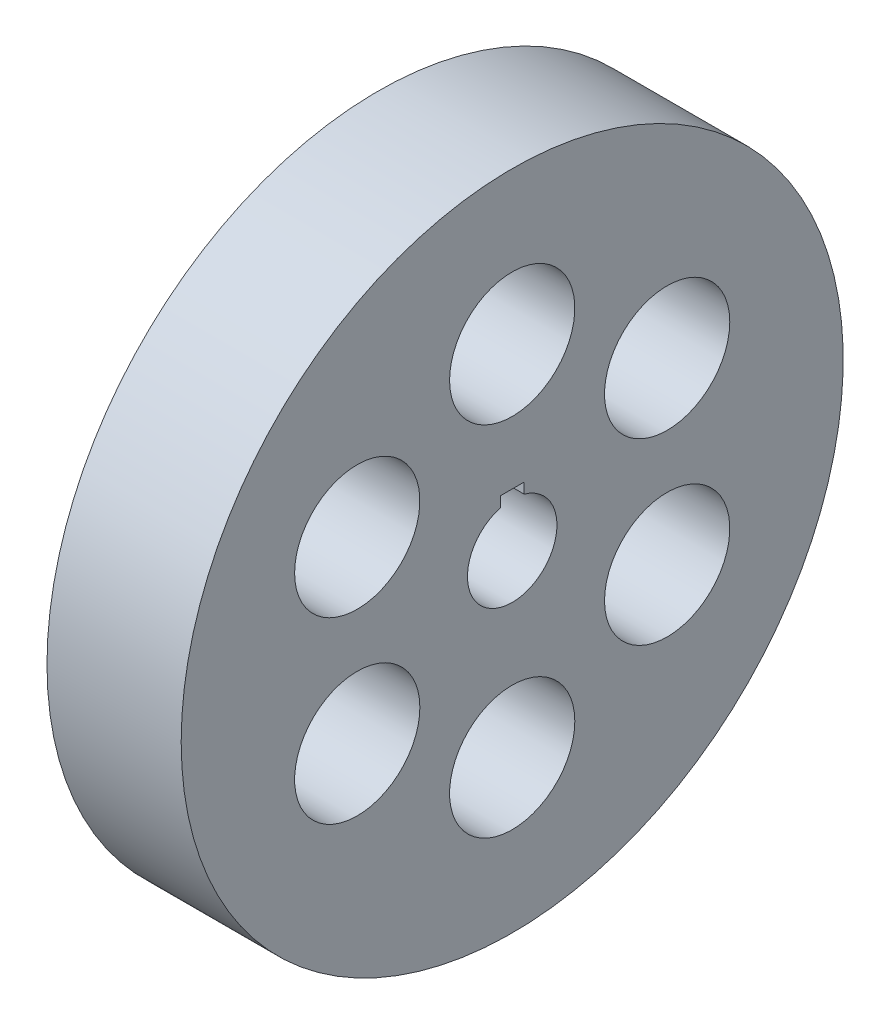
ISO-10303-21;
HEADER;
FILE_DESCRIPTION(('STEP AP214'),'2;1');
FILE_NAME('part.step','',(''),(''),'','','');
FILE_SCHEMA(('AUTOMOTIVE_DESIGN { 1 0 10303 214 1 1 1 1 }'));
ENDSEC;
DATA;
#1=APPLICATION_CONTEXT('core data for automotive mechanical design processes');
#2=APPLICATION_PROTOCOL_DEFINITION('international standard','automotive_design',2000,#1);
#3=PRODUCT_CONTEXT('',#1,'mechanical');
#4=PRODUCT('Part','Part','',(#3));
#5=PRODUCT_RELATED_PRODUCT_CATEGORY('part','',(#4));
#6=PRODUCT_DEFINITION_FORMATION('','',#4);
#7=PRODUCT_DEFINITION_CONTEXT('part definition',#1,'design');
#8=PRODUCT_DEFINITION('design','',#6,#7);
#9=PRODUCT_DEFINITION_SHAPE('','',#8);
#10=(LENGTH_UNIT() NAMED_UNIT(*) SI_UNIT(.MILLI.,.METRE.));
#11=(NAMED_UNIT(*) PLANE_ANGLE_UNIT() SI_UNIT($,.RADIAN.));
#12=(NAMED_UNIT(*) SI_UNIT($,.STERADIAN.) SOLID_ANGLE_UNIT());
#13=UNCERTAINTY_MEASURE_WITH_UNIT(LENGTH_MEASURE(1.E-05),#10,'distance_accuracy_value','');
#14=(GEOMETRIC_REPRESENTATION_CONTEXT(3) GLOBAL_UNCERTAINTY_ASSIGNED_CONTEXT((#13)) GLOBAL_UNIT_ASSIGNED_CONTEXT((#10,
#11,#12)) REPRESENTATION_CONTEXT('',''));
#15=CARTESIAN_POINT('',(0.,0.,0.));
#16=DIRECTION('',(0.,0.,1.));
#17=DIRECTION('',(1.,0.,0.));
#18=AXIS2_PLACEMENT_3D('',#15,#16,#17);
#19=CARTESIAN_POINT('',(70.,0.,-111.));
#20=DIRECTION('',(-1.,0.,0.));
#21=DIRECTION('',(0.,0.,1.));
#22=AXIS2_PLACEMENT_3D('',#19,#20,#21);
#23=PLANE('',#22);
#24=DIRECTION('',(0.,1.,0.));
#25=VECTOR('',#24,1.);
#26=CARTESIAN_POINT('',(70.,11.5,4.));
#27=LINE('',#26,#25);
#28=CARTESIAN_POINT('',(70.,14.456832294801,4.));
#29=VERTEX_POINT('',#28);
#30=CARTESIAN_POINT('',(70.,17.956832294801,4.));
#31=VERTEX_POINT('',#30);
#32=EDGE_CURVE('E97',#29,#31,#27,.T.);
#33=ORIENTED_EDGE('',*,*,#32,.T.);
#34=DIRECTION('',(0.,0.,-1.));
#35=VECTOR('',#34,1.);
#36=CARTESIAN_POINT('',(70.,17.956832294801,-4.));
#37=LINE('',#36,#35);
#38=CARTESIAN_POINT('',(70.,17.956832294801,-4.));
#39=VERTEX_POINT('',#38);
#40=EDGE_CURVE('E102',#31,#39,#37,.T.);
#41=ORIENTED_EDGE('',*,*,#40,.T.);
#42=DIRECTION('',(0.,-1.,0.));
#43=VECTOR('',#42,1.);
#44=CARTESIAN_POINT('',(70.,11.5,-4.));
#45=LINE('',#44,#43);
#46=CARTESIAN_POINT('',(70.,14.456832294801,-4.));
#47=VERTEX_POINT('',#46);
#48=EDGE_CURVE('E61',#39,#47,#45,.T.);
#49=ORIENTED_EDGE('',*,*,#48,.T.);
#50=CARTESIAN_POINT('',(70.,0.,0.));
#51=DIRECTION('',(-1.,0.,0.));
#52=DIRECTION('',(0.,0.,1.));
#53=AXIS2_PLACEMENT_3D('',#50,#51,#52);
#54=CIRCLE('',#53,15.);
#55=EDGE_CURVE('E106',#47,#29,#54,.T.);
#56=ORIENTED_EDGE('',*,*,#55,.T.);
#57=EDGE_LOOP('',(#33,#41,#49,#56));
#58=FACE_BOUND('',#57,.T.);
#59=CARTESIAN_POINT('',(70.,30.0000000000001,51.9615242270663));
#60=DIRECTION('',(-1.,0.,0.));
#61=DIRECTION('',(0.,0.,1.));
#62=AXIS2_PLACEMENT_3D('',#59,#60,#61);
#63=CIRCLE('',#62,21.);
#64=CARTESIAN_POINT('',(70.,30.0000000000001,72.9615242270663));
#65=VERTEX_POINT('',#64);
#66=EDGE_CURVE('E116',#65,#65,#63,.T.);
#67=ORIENTED_EDGE('',*,*,#66,.T.);
#68=EDGE_LOOP('',(#67));
#69=FACE_BOUND('',#68,.T.);
#70=CARTESIAN_POINT('',(70.,30.0000000000001,-51.9615242270663));
#71=DIRECTION('',(-1.,0.,0.));
#72=DIRECTION('',(0.,0.,-1.));
#73=AXIS2_PLACEMENT_3D('',#70,#71,#72);
#74=CIRCLE('',#73,21.);
#75=CARTESIAN_POINT('',(70.,30.0000000000001,-72.9615242270663));
#76=VERTEX_POINT('',#75);
#77=EDGE_CURVE('E123',#76,#76,#74,.T.);
#78=ORIENTED_EDGE('',*,*,#77,.T.);
#79=EDGE_LOOP('',(#78));
#80=FACE_BOUND('',#79,.T.);
#81=CARTESIAN_POINT('',(70.,-30.0000000000001,51.9615242270663));
#82=DIRECTION('',(-1.,0.,0.));
#83=DIRECTION('',(0.,0.,-1.));
#84=AXIS2_PLACEMENT_3D('',#81,#82,#83);
#85=CIRCLE('',#84,21.);
#86=CARTESIAN_POINT('',(70.,-30.0000000000001,30.9615242270663));
#87=VERTEX_POINT('',#86);
#88=EDGE_CURVE('E129',#87,#87,#85,.T.);
#89=ORIENTED_EDGE('',*,*,#88,.T.);
#90=EDGE_LOOP('',(#89));
#91=FACE_BOUND('',#90,.T.);
#92=CARTESIAN_POINT('',(70.,-60.,0.));
#93=DIRECTION('',(-1.,0.,0.));
#94=DIRECTION('',(0.,0.,-1.));
#95=AXIS2_PLACEMENT_3D('',#92,#93,#94);
#96=CIRCLE('',#95,21.);
#97=CARTESIAN_POINT('',(70.,-60.,-21.));
#98=VERTEX_POINT('',#97);
#99=EDGE_CURVE('E135',#98,#98,#96,.T.);
#100=ORIENTED_EDGE('',*,*,#99,.T.);
#101=EDGE_LOOP('',(#100));
#102=FACE_BOUND('',#101,.T.);
#103=CARTESIAN_POINT('',(70.,-30.0000000000001,-51.9615242270663));
#104=DIRECTION('',(-1.,0.,0.));
#105=DIRECTION('',(0.,0.,1.));
#106=AXIS2_PLACEMENT_3D('',#103,#104,#105);
#107=CIRCLE('',#106,21.);
#108=CARTESIAN_POINT('',(70.,-30.0000000000001,-30.9615242270663));
#109=VERTEX_POINT('',#108);
#110=EDGE_CURVE('E110',#109,#109,#107,.T.);
#111=ORIENTED_EDGE('',*,*,#110,.T.);
#112=EDGE_LOOP('',(#111));
#113=FACE_BOUND('',#112,.T.);
#114=CARTESIAN_POINT('',(70.,60.,0.));
#115=DIRECTION('',(-1.,0.,0.));
#116=DIRECTION('',(0.,0.,1.));
#117=AXIS2_PLACEMENT_3D('',#114,#115,#116);
#118=CIRCLE('',#117,21.);
#119=CARTESIAN_POINT('',(70.,60.,21.));
#120=VERTEX_POINT('',#119);
#121=EDGE_CURVE('E140',#120,#120,#118,.T.);
#122=ORIENTED_EDGE('',*,*,#121,.T.);
#123=EDGE_LOOP('',(#122));
#124=FACE_BOUND('',#123,.T.);
#125=CARTESIAN_POINT('',(70.,0.,0.));
#126=DIRECTION('',(-1.,0.,0.));
#127=DIRECTION('',(0.,0.,1.));
#128=AXIS2_PLACEMENT_3D('',#125,#126,#127);
#129=CIRCLE('',#128,111.);
#130=CARTESIAN_POINT('',(70.,0.,111.));
#131=VERTEX_POINT('',#130);
#132=EDGE_CURVE('E163',#131,#131,#129,.T.);
#133=ORIENTED_EDGE('',*,*,#132,.F.);
#134=EDGE_LOOP('',(#133));
#135=FACE_BOUND('',#134,.T.);
#136=ADVANCED_FACE('F39',(#58,#69,#80,#91,#102,#113,#124,#135),#23,.F.);
#137=CARTESIAN_POINT('',(-137.76,0.,0.));
#138=DIRECTION('',(-1.,0.,0.));
#139=DIRECTION('',(0.,0.,1.));
#140=AXIS2_PLACEMENT_3D('',#137,#138,#139);
#141=CYLINDRICAL_SURFACE('',#140,111.);
#142=CARTESIAN_POINT('',(25.,0.,0.));
#143=DIRECTION('',(-1.,0.,0.));
#144=DIRECTION('',(0.,0.,1.));
#145=AXIS2_PLACEMENT_3D('',#142,#143,#144);
#146=CIRCLE('',#145,111.);
#147=CARTESIAN_POINT('',(25.,0.,111.));
#148=VERTEX_POINT('',#147);
#149=EDGE_CURVE('E160',#148,#148,#146,.T.);
#150=ORIENTED_EDGE('',*,*,#149,.F.);
#151=EDGE_LOOP('',(#150));
#152=FACE_BOUND('',#151,.T.);
#153=ORIENTED_EDGE('',*,*,#132,.T.);
#154=EDGE_LOOP('',(#153));
#155=FACE_BOUND('',#154,.T.);
#156=ADVANCED_FACE('F183',(#152,#155),#141,.T.);
#157=CARTESIAN_POINT('',(25.,0.,-96.));
#158=DIRECTION('',(1.,0.,0.));
#159=DIRECTION('',(0.,0.,-1.));
#160=AXIS2_PLACEMENT_3D('',#157,#158,#159);
#161=PLANE('',#160);
#162=CARTESIAN_POINT('',(25.,0.,0.));
#163=DIRECTION('',(-1.,0.,0.));
#164=DIRECTION('',(0.,0.,1.));
#165=AXIS2_PLACEMENT_3D('',#162,#163,#164);
#166=CIRCLE('',#165,96.);
#167=CARTESIAN_POINT('',(25.,0.,96.));
#168=VERTEX_POINT('',#167);
#169=EDGE_CURVE('E157',#168,#168,#166,.T.);
#170=ORIENTED_EDGE('',*,*,#169,.F.);
#171=EDGE_LOOP('',(#170));
#172=FACE_BOUND('',#171,.T.);
#173=ORIENTED_EDGE('',*,*,#149,.T.);
#174=EDGE_LOOP('',(#173));
#175=FACE_BOUND('',#174,.T.);
#176=ADVANCED_FACE('F187',(#172,#175),#161,.F.);
#177=CARTESIAN_POINT('',(-137.76,0.,0.));
#178=DIRECTION('',(-1.,0.,0.));
#179=DIRECTION('',(0.,0.,1.));
#180=AXIS2_PLACEMENT_3D('',#177,#178,#179);
#181=CYLINDRICAL_SURFACE('',#180,96.);
#182=CARTESIAN_POINT('',(29.9999999999999,0.,0.));
#183=DIRECTION('',(-1.,0.,0.));
#184=DIRECTION('',(0.,0.,1.));
#185=AXIS2_PLACEMENT_3D('',#182,#183,#184);
#186=CIRCLE('',#185,96.);
#187=CARTESIAN_POINT('',(29.9999999999999,0.,96.));
#188=VERTEX_POINT('',#187);
#189=EDGE_CURVE('E154',#188,#188,#186,.T.);
#190=ORIENTED_EDGE('',*,*,#189,.F.);
#191=EDGE_LOOP('',(#190));
#192=FACE_BOUND('',#191,.T.);
#193=ORIENTED_EDGE('',*,*,#169,.T.);
#194=EDGE_LOOP('',(#193));
#195=FACE_BOUND('',#194,.T.);
#196=ADVANCED_FACE('F192',(#192,#195),#181,.F.);
#197=CARTESIAN_POINT('',(30.,0.,0.));
#198=DIRECTION('',(-1.,0.,0.));
#199=DIRECTION('',(0.,0.,1.));
#200=AXIS2_PLACEMENT_3D('',#197,#198,#199);
#201=TOROIDAL_SURFACE('',#200,91.,5.);
#202=CARTESIAN_POINT('',(35.,0.,0.));
#203=DIRECTION('',(-1.,0.,0.));
#204=DIRECTION('',(0.,0.,1.));
#205=AXIS2_PLACEMENT_3D('',#202,#203,#204);
#206=CIRCLE('',#205,91.);
#207=CARTESIAN_POINT('',(35.,0.,91.));
#208=VERTEX_POINT('',#207);
#209=EDGE_CURVE('E151',#208,#208,#206,.T.);
#210=ORIENTED_EDGE('',*,*,#209,.F.);
#211=EDGE_LOOP('',(#210));
#212=FACE_BOUND('',#211,.T.);
#213=ORIENTED_EDGE('',*,*,#189,.T.);
#214=EDGE_LOOP('',(#213));
#215=FACE_BOUND('',#214,.T.);
#216=ADVANCED_FACE('F200',(#212,#215),#201,.F.);
#217=CARTESIAN_POINT('',(35.,0.,-30.));
#218=DIRECTION('',(1.,0.,0.));
#219=DIRECTION('',(0.,0.,-1.));
#220=AXIS2_PLACEMENT_3D('',#217,#218,#219);
#221=PLANE('',#220);
#222=CARTESIAN_POINT('',(35.,30.0000000000001,51.9615242270663));
#223=DIRECTION('',(-1.,0.,0.));
#224=DIRECTION('',(0.,0.,1.));
#225=AXIS2_PLACEMENT_3D('',#222,#223,#224);
#226=CIRCLE('',#225,21.);
#227=CARTESIAN_POINT('',(35.,30.0000000000001,72.9615242270663));
#228=VERTEX_POINT('',#227);
#229=EDGE_CURVE('E120',#228,#228,#226,.T.);
#230=ORIENTED_EDGE('',*,*,#229,.F.);
#231=EDGE_LOOP('',(#230));
#232=FACE_BOUND('',#231,.T.);
#233=CARTESIAN_POINT('',(35.,30.0000000000001,-51.9615242270663));
#234=DIRECTION('',(-1.,0.,0.));
#235=DIRECTION('',(0.,0.,-1.));
#236=AXIS2_PLACEMENT_3D('',#233,#234,#235);
#237=CIRCLE('',#236,21.);
#238=CARTESIAN_POINT('',(35.,30.0000000000001,-72.9615242270663));
#239=VERTEX_POINT('',#238);
#240=EDGE_CURVE('E126',#239,#239,#237,.T.);
#241=ORIENTED_EDGE('',*,*,#240,.F.);
#242=EDGE_LOOP('',(#241));
#243=FACE_BOUND('',#242,.T.);
#244=CARTESIAN_POINT('',(35.,-30.0000000000001,51.9615242270663));
#245=DIRECTION('',(-1.,0.,0.));
#246=DIRECTION('',(0.,0.,-1.));
#247=AXIS2_PLACEMENT_3D('',#244,#245,#246);
#248=CIRCLE('',#247,21.);
#249=CARTESIAN_POINT('',(35.,-30.0000000000001,30.9615242270663));
#250=VERTEX_POINT('',#249);
#251=EDGE_CURVE('E132',#250,#250,#248,.T.);
#252=ORIENTED_EDGE('',*,*,#251,.F.);
#253=EDGE_LOOP('',(#252));
#254=FACE_BOUND('',#253,.T.);
#255=CARTESIAN_POINT('',(35.,-60.,0.));
#256=DIRECTION('',(-1.,0.,0.));
#257=DIRECTION('',(0.,0.,-1.));
#258=AXIS2_PLACEMENT_3D('',#255,#256,#257);
#259=CIRCLE('',#258,21.);
#260=CARTESIAN_POINT('',(35.,-60.,-21.));
#261=VERTEX_POINT('',#260);
#262=EDGE_CURVE('E113',#261,#261,#259,.T.);
#263=ORIENTED_EDGE('',*,*,#262,.F.);
#264=EDGE_LOOP('',(#263));
#265=FACE_BOUND('',#264,.T.);
#266=CARTESIAN_POINT('',(35.,-30.0000000000001,-51.9615242270663));
#267=DIRECTION('',(-1.,0.,0.));
#268=DIRECTION('',(0.,0.,1.));
#269=AXIS2_PLACEMENT_3D('',#266,#267,#268);
#270=CIRCLE('',#269,21.);
#271=CARTESIAN_POINT('',(35.,-30.0000000000001,-30.9615242270663));
#272=VERTEX_POINT('',#271);
#273=EDGE_CURVE('E108',#272,#272,#270,.T.);
#274=ORIENTED_EDGE('',*,*,#273,.F.);
#275=EDGE_LOOP('',(#274));
#276=FACE_BOUND('',#275,.T.);
#277=CARTESIAN_POINT('',(35.,60.,0.));
#278=DIRECTION('',(-1.,0.,0.));
#279=DIRECTION('',(0.,0.,1.));
#280=AXIS2_PLACEMENT_3D('',#277,#278,#279);
#281=CIRCLE('',#280,21.);
#282=CARTESIAN_POINT('',(35.,60.,21.));
#283=VERTEX_POINT('',#282);
#284=EDGE_CURVE('E119',#283,#283,#281,.T.);
#285=ORIENTED_EDGE('',*,*,#284,.F.);
#286=EDGE_LOOP('',(#285));
#287=FACE_BOUND('',#286,.T.);
#288=CARTESIAN_POINT('',(35.,0.,0.));
#289=DIRECTION('',(-1.,0.,0.));
#290=DIRECTION('',(0.,0.,1.));
#291=AXIS2_PLACEMENT_3D('',#288,#289,#290);
#292=CIRCLE('',#291,30.);
#293=CARTESIAN_POINT('',(35.,0.,30.));
#294=VERTEX_POINT('',#293);
#295=EDGE_CURVE('E148',#294,#294,#292,.T.);
#296=ORIENTED_EDGE('',*,*,#295,.F.);
#297=EDGE_LOOP('',(#296));
#298=FACE_BOUND('',#297,.T.);
#299=ORIENTED_EDGE('',*,*,#209,.T.);
#300=EDGE_LOOP('',(#299));
#301=FACE_BOUND('',#300,.T.);
#302=ADVANCED_FACE('F204',(#232,#243,#254,#265,#276,#287,#298,#301),#221,.F.);
#303=CARTESIAN_POINT('',(-137.76,0.,0.));
#304=DIRECTION('',(-1.,0.,0.));
#305=DIRECTION('',(0.,0.,1.));
#306=AXIS2_PLACEMENT_3D('',#303,#304,#305);
#307=CYLINDRICAL_SURFACE('',#306,30.);
#308=CARTESIAN_POINT('',(0.,0.,0.));
#309=DIRECTION('',(-1.,0.,0.));
#310=DIRECTION('',(0.,0.,1.));
#311=AXIS2_PLACEMENT_3D('',#308,#309,#310);
#312=CIRCLE('',#311,30.);
#313=CARTESIAN_POINT('',(0.,0.,30.));
#314=VERTEX_POINT('',#313);
#315=EDGE_CURVE('E143',#314,#314,#312,.T.);
#316=ORIENTED_EDGE('',*,*,#315,.F.);
#317=EDGE_LOOP('',(#316));
#318=FACE_BOUND('',#317,.T.);
#319=ORIENTED_EDGE('',*,*,#295,.T.);
#320=EDGE_LOOP('',(#319));
#321=FACE_BOUND('',#320,.T.);
#322=ADVANCED_FACE('F208',(#318,#321),#307,.T.);
#323=CARTESIAN_POINT('',(0.,0.,0.));
#324=DIRECTION('',(1.,0.,0.));
#325=DIRECTION('',(0.,0.,-1.));
#326=AXIS2_PLACEMENT_3D('',#323,#324,#325);
#327=PLANE('',#326);
#328=DIRECTION('',(0.,-1.,0.));
#329=VECTOR('',#328,1.);
#330=CARTESIAN_POINT('',(0.,11.5,-4.));
#331=LINE('',#330,#329);
#332=CARTESIAN_POINT('',(0.,17.956832294801,-4.));
#333=VERTEX_POINT('',#332);
#334=CARTESIAN_POINT('',(0.,14.456832294801,-4.));
#335=VERTEX_POINT('',#334);
#336=EDGE_CURVE('E53',#333,#335,#331,.T.);
#337=ORIENTED_EDGE('',*,*,#336,.F.);
#338=DIRECTION('',(0.,0.,1.));
#339=VECTOR('',#338,1.);
#340=CARTESIAN_POINT('',(0.,17.956832294801,-4.));
#341=LINE('',#340,#339);
#342=CARTESIAN_POINT('',(0.,17.956832294801,4.));
#343=VERTEX_POINT('',#342);
#344=EDGE_CURVE('E81',#333,#343,#341,.T.);
#345=ORIENTED_EDGE('',*,*,#344,.T.);
#346=DIRECTION('',(0.,1.,0.));
#347=VECTOR('',#346,1.);
#348=CARTESIAN_POINT('',(0.,11.5,4.));
#349=LINE('',#348,#347);
#350=CARTESIAN_POINT('',(0.,14.456832294801,4.));
#351=VERTEX_POINT('',#350);
#352=EDGE_CURVE('E98',#351,#343,#349,.T.);
#353=ORIENTED_EDGE('',*,*,#352,.F.);
#354=CARTESIAN_POINT('',(0.,0.,0.));
#355=DIRECTION('',(-1.,0.,0.));
#356=DIRECTION('',(0.,0.,1.));
#357=AXIS2_PLACEMENT_3D('',#354,#355,#356);
#358=CIRCLE('',#357,15.);
#359=EDGE_CURVE('E96',#335,#351,#358,.T.);
#360=ORIENTED_EDGE('',*,*,#359,.F.);
#361=EDGE_LOOP('',(#337,#345,#353,#360));
#362=FACE_BOUND('',#361,.T.);
#363=ORIENTED_EDGE('',*,*,#315,.T.);
#364=EDGE_LOOP('',(#363));
#365=FACE_BOUND('',#364,.T.);
#366=ADVANCED_FACE('F93',(#362,#365),#327,.F.);
#367=CARTESIAN_POINT('',(70.,60.,0.));
#368=DIRECTION('',(-1.,0.,0.));
#369=DIRECTION('',(0.,0.,1.));
#370=AXIS2_PLACEMENT_3D('',#367,#368,#369);
#371=CYLINDRICAL_SURFACE('',#370,21.);
#372=ORIENTED_EDGE('',*,*,#121,.F.);
#373=EDGE_LOOP('',(#372));
#374=FACE_BOUND('',#373,.T.);
#375=ORIENTED_EDGE('',*,*,#284,.T.);
#376=EDGE_LOOP('',(#375));
#377=FACE_BOUND('',#376,.T.);
#378=ADVANCED_FACE('F215',(#374,#377),#371,.F.);
#379=CARTESIAN_POINT('',(70.,-30.0000000000001,-51.9615242270663));
#380=DIRECTION('',(-1.,0.,0.));
#381=DIRECTION('',(0.,0.,1.));
#382=AXIS2_PLACEMENT_3D('',#379,#380,#381);
#383=CYLINDRICAL_SURFACE('',#382,21.);
#384=ORIENTED_EDGE('',*,*,#110,.F.);
#385=EDGE_LOOP('',(#384));
#386=FACE_BOUND('',#385,.T.);
#387=ORIENTED_EDGE('',*,*,#273,.T.);
#388=EDGE_LOOP('',(#387));
#389=FACE_BOUND('',#388,.T.);
#390=ADVANCED_FACE('F218',(#386,#389),#383,.F.);
#391=CARTESIAN_POINT('',(70.,-60.,0.));
#392=DIRECTION('',(-1.,0.,0.));
#393=DIRECTION('',(0.,0.,1.));
#394=AXIS2_PLACEMENT_3D('',#391,#392,#393);
#395=CYLINDRICAL_SURFACE('',#394,21.);
#396=ORIENTED_EDGE('',*,*,#99,.F.);
#397=EDGE_LOOP('',(#396));
#398=FACE_BOUND('',#397,.T.);
#399=ORIENTED_EDGE('',*,*,#262,.T.);
#400=EDGE_LOOP('',(#399));
#401=FACE_BOUND('',#400,.T.);
#402=ADVANCED_FACE('F220',(#398,#401),#395,.F.);
#403=CARTESIAN_POINT('',(70.,-30.0000000000001,51.9615242270663));
#404=DIRECTION('',(-1.,0.,0.));
#405=DIRECTION('',(0.,0.,1.));
#406=AXIS2_PLACEMENT_3D('',#403,#404,#405);
#407=CYLINDRICAL_SURFACE('',#406,21.);
#408=ORIENTED_EDGE('',*,*,#88,.F.);
#409=EDGE_LOOP('',(#408));
#410=FACE_BOUND('',#409,.T.);
#411=ORIENTED_EDGE('',*,*,#251,.T.);
#412=EDGE_LOOP('',(#411));
#413=FACE_BOUND('',#412,.T.);
#414=ADVANCED_FACE('F223',(#410,#413),#407,.F.);
#415=CARTESIAN_POINT('',(70.,30.0000000000001,-51.9615242270663));
#416=DIRECTION('',(-1.,0.,0.));
#417=DIRECTION('',(0.,0.,1.));
#418=AXIS2_PLACEMENT_3D('',#415,#416,#417);
#419=CYLINDRICAL_SURFACE('',#418,21.);
#420=ORIENTED_EDGE('',*,*,#77,.F.);
#421=EDGE_LOOP('',(#420));
#422=FACE_BOUND('',#421,.T.);
#423=ORIENTED_EDGE('',*,*,#240,.T.);
#424=EDGE_LOOP('',(#423));
#425=FACE_BOUND('',#424,.T.);
#426=ADVANCED_FACE('F227',(#422,#425),#419,.F.);
#427=CARTESIAN_POINT('',(70.,30.0000000000001,51.9615242270663));
#428=DIRECTION('',(-1.,0.,0.));
#429=DIRECTION('',(0.,0.,1.));
#430=AXIS2_PLACEMENT_3D('',#427,#428,#429);
#431=CYLINDRICAL_SURFACE('',#430,21.);
#432=ORIENTED_EDGE('',*,*,#66,.F.);
#433=EDGE_LOOP('',(#432));
#434=FACE_BOUND('',#433,.T.);
#435=ORIENTED_EDGE('',*,*,#229,.T.);
#436=EDGE_LOOP('',(#435));
#437=FACE_BOUND('',#436,.T.);
#438=ADVANCED_FACE('F180',(#434,#437),#431,.F.);
#439=CARTESIAN_POINT('',(70.,0.,0.));
#440=DIRECTION('',(-1.,0.,0.));
#441=DIRECTION('',(0.,0.,1.));
#442=AXIS2_PLACEMENT_3D('',#439,#440,#441);
#443=CYLINDRICAL_SURFACE('',#442,15.);
#444=ORIENTED_EDGE('',*,*,#359,.T.);
#445=DIRECTION('',(-1.,0.,0.));
#446=VECTOR('',#445,1.);
#447=CARTESIAN_POINT('',(70.,14.456832294801,4.));
#448=LINE('',#447,#446);
#449=EDGE_CURVE('E11',#351,#29,#448,.F.);
#450=ORIENTED_EDGE('',*,*,#449,.T.);
#451=ORIENTED_EDGE('',*,*,#55,.F.);
#452=DIRECTION('',(-1.,0.,0.));
#453=VECTOR('',#452,1.);
#454=CARTESIAN_POINT('',(70.,14.456832294801,-4.));
#455=LINE('',#454,#453);
#456=EDGE_CURVE('E46',#47,#335,#455,.T.);
#457=ORIENTED_EDGE('',*,*,#456,.T.);
#458=EDGE_LOOP('',(#444,#450,#451,#457));
#459=FACE_BOUND('',#458,.T.);
#460=ADVANCED_FACE('F167',(#459),#443,.F.);
#461=CARTESIAN_POINT('',(70.,11.5,4.));
#462=DIRECTION('',(0.,0.,1.));
#463=DIRECTION('',(1.,0.,0.));
#464=AXIS2_PLACEMENT_3D('',#461,#462,#463);
#465=PLANE('',#464);
#466=ORIENTED_EDGE('',*,*,#352,.T.);
#467=DIRECTION('',(-1.,0.,0.));
#468=VECTOR('',#467,1.);
#469=CARTESIAN_POINT('',(78.0184182452633,17.956832294801,4.));
#470=LINE('',#469,#468);
#471=EDGE_CURVE('E85',#31,#343,#470,.T.);
#472=ORIENTED_EDGE('',*,*,#471,.F.);
#473=ORIENTED_EDGE('',*,*,#32,.F.);
#474=ORIENTED_EDGE('',*,*,#449,.F.);
#475=EDGE_LOOP('',(#466,#472,#473,#474));
#476=FACE_BOUND('',#475,.T.);
#477=ADVANCED_FACE('F170',(#476),#465,.F.);
#478=CARTESIAN_POINT('',(70.,11.5,-4.));
#479=DIRECTION('',(0.,0.,-1.));
#480=DIRECTION('',(-1.,0.,0.));
#481=AXIS2_PLACEMENT_3D('',#478,#479,#480);
#482=PLANE('',#481);
#483=ORIENTED_EDGE('',*,*,#48,.F.);
#484=DIRECTION('',(-1.,0.,0.));
#485=VECTOR('',#484,1.);
#486=CARTESIAN_POINT('',(78.0184182452633,17.956832294801,-4.));
#487=LINE('',#486,#485);
#488=EDGE_CURVE('E83',#39,#333,#487,.T.);
#489=ORIENTED_EDGE('',*,*,#488,.T.);
#490=ORIENTED_EDGE('',*,*,#336,.T.);
#491=ORIENTED_EDGE('',*,*,#456,.F.);
#492=EDGE_LOOP('',(#483,#489,#490,#491));
#493=FACE_BOUND('',#492,.T.);
#494=ADVANCED_FACE('F90',(#493),#482,.F.);
#495=CARTESIAN_POINT('',(78.0184182452633,17.956832294801,-4.));
#496=DIRECTION('',(0.,-1.,0.));
#497=DIRECTION('',(0.,0.,-1.));
#498=AXIS2_PLACEMENT_3D('',#495,#496,#497);
#499=PLANE('',#498);
#500=ORIENTED_EDGE('',*,*,#40,.F.);
#501=ORIENTED_EDGE('',*,*,#471,.T.);
#502=ORIENTED_EDGE('',*,*,#344,.F.);
#503=ORIENTED_EDGE('',*,*,#488,.F.);
#504=EDGE_LOOP('',(#500,#501,#502,#503));
#505=FACE_BOUND('',#504,.T.);
#506=ADVANCED_FACE('F82',(#505),#499,.T.);
#507=CLOSED_SHELL('',(#136,#156,#176,#196,#216,#302,#322,#366,#378,#390,#402,#414,#426,#438,
#460,#477,#494,#506));
#508=MANIFOLD_SOLID_BREP('B2',#507);
#509=ADVANCED_BREP_SHAPE_REPRESENTATION('',(#18,#508),#14);
#510=SHAPE_DEFINITION_REPRESENTATION(#9,#509);
ENDSEC;
END-ISO-10303-21;
